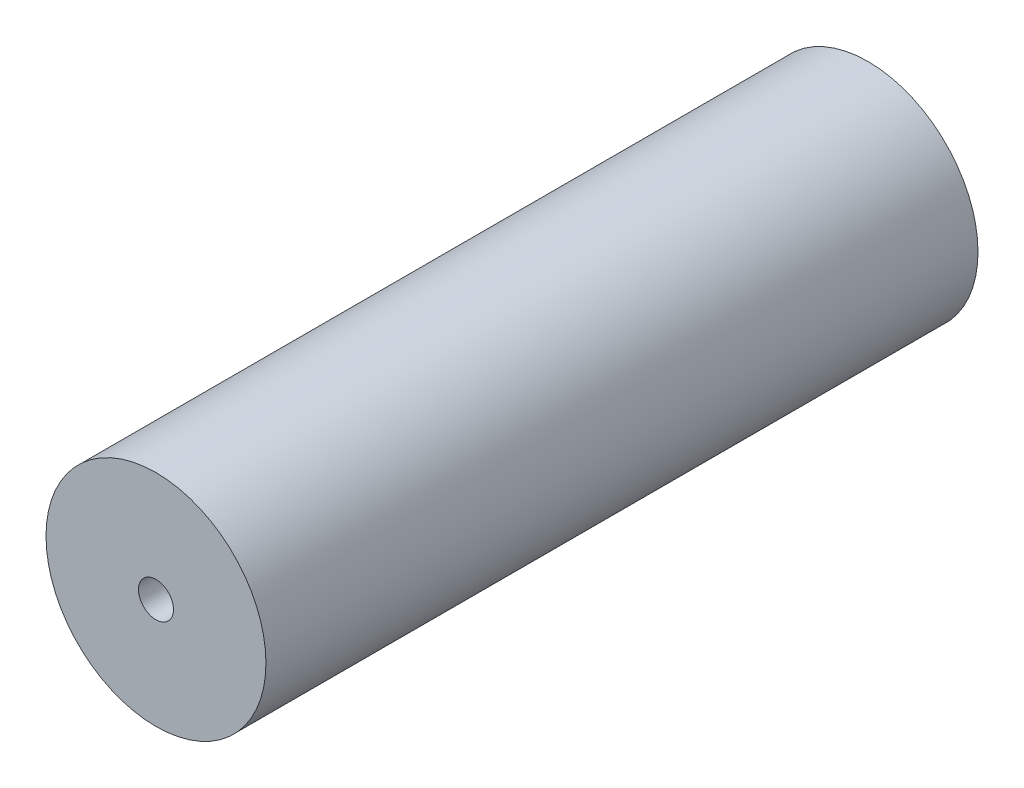
ISO-10303-21;
HEADER;
FILE_DESCRIPTION(('STEP AP214'),'2;1');
FILE_NAME('part.step','',(''),(''),'','','');
FILE_SCHEMA(('AUTOMOTIVE_DESIGN { 1 0 10303 214 1 1 1 1 }'));
ENDSEC;
DATA;
#1=APPLICATION_CONTEXT('core data for automotive mechanical design processes');
#2=APPLICATION_PROTOCOL_DEFINITION('international standard','automotive_design',2000,#1);
#3=PRODUCT_CONTEXT('',#1,'mechanical');
#4=PRODUCT('Part','Part','',(#3));
#5=PRODUCT_RELATED_PRODUCT_CATEGORY('part','',(#4));
#6=PRODUCT_DEFINITION_FORMATION('','',#4);
#7=PRODUCT_DEFINITION_CONTEXT('part definition',#1,'design');
#8=PRODUCT_DEFINITION('design','',#6,#7);
#9=PRODUCT_DEFINITION_SHAPE('','',#8);
#10=(LENGTH_UNIT() NAMED_UNIT(*) SI_UNIT(.MILLI.,.METRE.));
#11=(NAMED_UNIT(*) PLANE_ANGLE_UNIT() SI_UNIT($,.RADIAN.));
#12=(NAMED_UNIT(*) SI_UNIT($,.STERADIAN.) SOLID_ANGLE_UNIT());
#13=UNCERTAINTY_MEASURE_WITH_UNIT(LENGTH_MEASURE(1.E-05),#10,'distance_accuracy_value','');
#14=(GEOMETRIC_REPRESENTATION_CONTEXT(3) GLOBAL_UNCERTAINTY_ASSIGNED_CONTEXT((#13)) GLOBAL_UNIT_ASSIGNED_CONTEXT((#10,
#11,#12)) REPRESENTATION_CONTEXT('',''));
#15=CARTESIAN_POINT('',(0.,0.,0.));
#16=DIRECTION('',(0.,0.,1.));
#17=DIRECTION('',(1.,0.,0.));
#18=AXIS2_PLACEMENT_3D('',#15,#16,#17);
#19=CARTESIAN_POINT('',(0.,0.,82.2325));
#20=DIRECTION('',(0.,0.,1.));
#21=DIRECTION('',(1.,0.,0.));
#22=AXIS2_PLACEMENT_3D('',#19,#20,#21);
#23=PLANE('',#22);
#24=CARTESIAN_POINT('',(0.,0.,82.2325));
#25=DIRECTION('',(0.,0.,1.));
#26=DIRECTION('',(1.,0.,0.));
#27=AXIS2_PLACEMENT_3D('',#24,#25,#26);
#28=CIRCLE('',#27,12.7);
#29=CARTESIAN_POINT('',(12.7,0.,82.2325));
#30=VERTEX_POINT('',#29);
#31=EDGE_CURVE('E10',#30,#30,#28,.T.);
#32=ORIENTED_EDGE('',*,*,#31,.T.);
#33=EDGE_LOOP('',(#32));
#34=FACE_BOUND('',#33,.T.);
#35=CARTESIAN_POINT('',(0.,0.,82.2325));
#36=DIRECTION('',(0.,0.,1.));
#37=DIRECTION('',(1.,0.,0.));
#38=AXIS2_PLACEMENT_3D('',#35,#36,#37);
#39=CIRCLE('',#38,2.0193);
#40=CARTESIAN_POINT('',(2.0193,0.,82.2325));
#41=VERTEX_POINT('',#40);
#42=EDGE_CURVE('E62',#41,#41,#39,.T.);
#43=ORIENTED_EDGE('',*,*,#42,.F.);
#44=EDGE_LOOP('',(#43));
#45=FACE_BOUND('',#44,.T.);
#46=ADVANCED_FACE('F51',(#34,#45),#23,.T.);
#47=CARTESIAN_POINT('',(0.,0.,0.));
#48=DIRECTION('',(0.,0.,1.));
#49=DIRECTION('',(1.,0.,0.));
#50=AXIS2_PLACEMENT_3D('',#47,#48,#49);
#51=PLANE('',#50);
#52=CARTESIAN_POINT('',(0.,0.,0.));
#53=DIRECTION('',(0.,0.,1.));
#54=DIRECTION('',(1.,0.,0.));
#55=AXIS2_PLACEMENT_3D('',#52,#53,#54);
#56=CIRCLE('',#55,12.7);
#57=CARTESIAN_POINT('',(12.7,0.,0.));
#58=VERTEX_POINT('',#57);
#59=EDGE_CURVE('E55',#58,#58,#56,.T.);
#60=ORIENTED_EDGE('',*,*,#59,.F.);
#61=EDGE_LOOP('',(#60));
#62=FACE_BOUND('',#61,.T.);
#63=CARTESIAN_POINT('',(0.,0.,0.));
#64=DIRECTION('',(0.,0.,1.));
#65=DIRECTION('',(1.,0.,0.));
#66=AXIS2_PLACEMENT_3D('',#63,#64,#65);
#67=CIRCLE('',#66,2.0193);
#68=CARTESIAN_POINT('',(2.0193,0.,0.));
#69=VERTEX_POINT('',#68);
#70=EDGE_CURVE('E64',#69,#69,#67,.T.);
#71=ORIENTED_EDGE('',*,*,#70,.T.);
#72=EDGE_LOOP('',(#71));
#73=FACE_BOUND('',#72,.T.);
#74=ADVANCED_FACE('F74',(#62,#73),#51,.F.);
#75=CARTESIAN_POINT('',(0.,0.,82.2325));
#76=DIRECTION('',(0.,0.,-1.));
#77=DIRECTION('',(-1.,0.,0.));
#78=AXIS2_PLACEMENT_3D('',#75,#76,#77);
#79=CYLINDRICAL_SURFACE('',#78,12.7);
#80=ORIENTED_EDGE('',*,*,#31,.F.);
#81=EDGE_LOOP('',(#80));
#82=FACE_BOUND('',#81,.T.);
#83=ORIENTED_EDGE('',*,*,#59,.T.);
#84=EDGE_LOOP('',(#83));
#85=FACE_BOUND('',#84,.T.);
#86=ADVANCED_FACE('F53',(#82,#85),#79,.T.);
#87=CARTESIAN_POINT('',(0.,0.,82.2325));
#88=DIRECTION('',(0.,0.,-1.));
#89=DIRECTION('',(-1.,0.,0.));
#90=AXIS2_PLACEMENT_3D('',#87,#88,#89);
#91=CYLINDRICAL_SURFACE('',#90,2.0193);
#92=ORIENTED_EDGE('',*,*,#42,.T.);
#93=EDGE_LOOP('',(#92));
#94=FACE_BOUND('',#93,.T.);
#95=ORIENTED_EDGE('',*,*,#70,.F.);
#96=EDGE_LOOP('',(#95));
#97=FACE_BOUND('',#96,.T.);
#98=ADVANCED_FACE('F70',(#94,#97),#91,.F.);
#99=CLOSED_SHELL('',(#46,#74,#86,#98));
#100=MANIFOLD_SOLID_BREP('B2',#99);
#101=ADVANCED_BREP_SHAPE_REPRESENTATION('',(#18,#100),#14);
#102=SHAPE_DEFINITION_REPRESENTATION(#9,#101);
ENDSEC;
END-ISO-10303-21;
